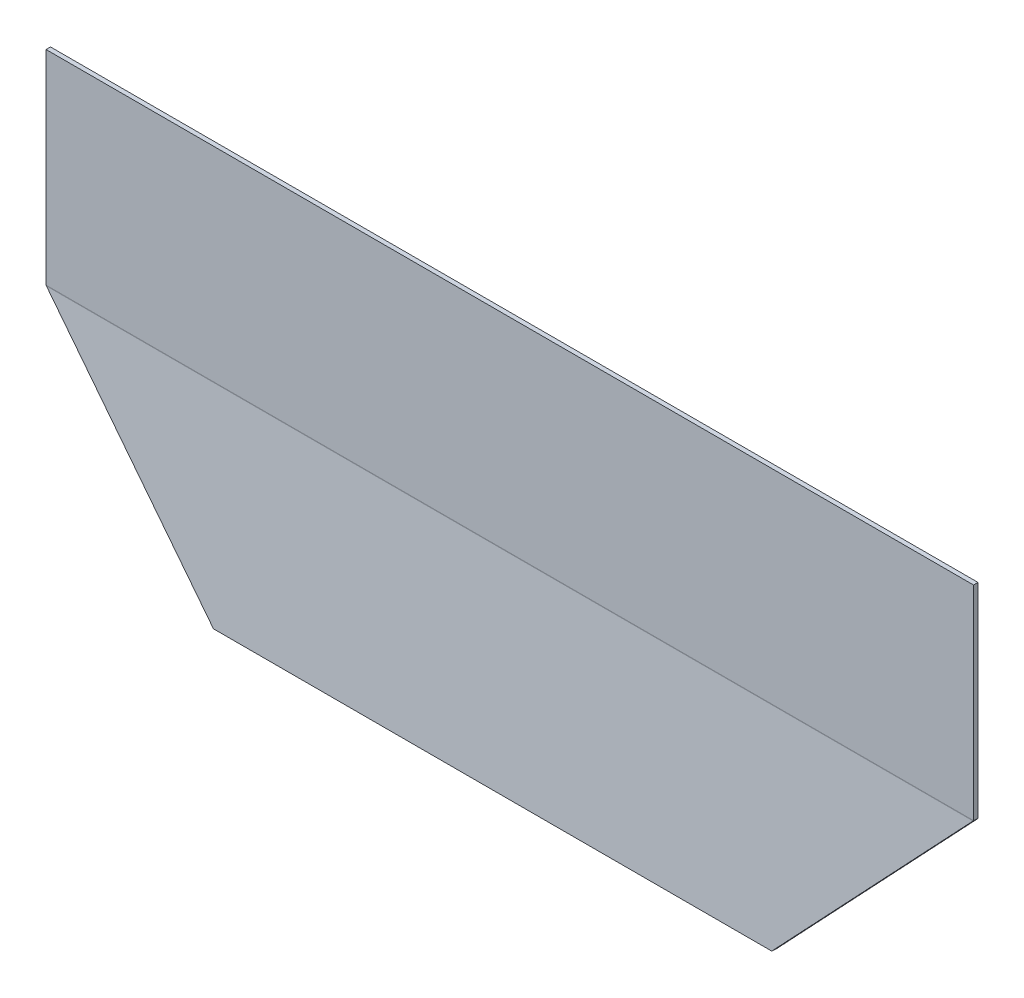
ISO-10303-21;
HEADER;
FILE_DESCRIPTION(('STEP AP214'),'2;1');
FILE_NAME('part.step','',(''),(''),'','','');
FILE_SCHEMA(('AUTOMOTIVE_DESIGN { 1 0 10303 214 1 1 1 1 }'));
ENDSEC;
DATA;
#1=APPLICATION_CONTEXT('core data for automotive mechanical design processes');
#2=APPLICATION_PROTOCOL_DEFINITION('international standard','automotive_design',2000,#1);
#3=PRODUCT_CONTEXT('',#1,'mechanical');
#4=PRODUCT('Part','Part','',(#3));
#5=PRODUCT_RELATED_PRODUCT_CATEGORY('part','',(#4));
#6=PRODUCT_DEFINITION_FORMATION('','',#4);
#7=PRODUCT_DEFINITION_CONTEXT('part definition',#1,'design');
#8=PRODUCT_DEFINITION('design','',#6,#7);
#9=PRODUCT_DEFINITION_SHAPE('','',#8);
#10=(LENGTH_UNIT() NAMED_UNIT(*) SI_UNIT(.MILLI.,.METRE.));
#11=(NAMED_UNIT(*) PLANE_ANGLE_UNIT() SI_UNIT($,.RADIAN.));
#12=(NAMED_UNIT(*) SI_UNIT($,.STERADIAN.) SOLID_ANGLE_UNIT());
#13=UNCERTAINTY_MEASURE_WITH_UNIT(LENGTH_MEASURE(1.E-05),#10,'distance_accuracy_value','');
#14=(GEOMETRIC_REPRESENTATION_CONTEXT(3) GLOBAL_UNCERTAINTY_ASSIGNED_CONTEXT((#13)) GLOBAL_UNIT_ASSIGNED_CONTEXT((#10,
#11,#12)) REPRESENTATION_CONTEXT('',''));
#15=CARTESIAN_POINT('',(0.,0.,0.));
#16=DIRECTION('',(0.,0.,1.));
#17=DIRECTION('',(1.,0.,0.));
#18=AXIS2_PLACEMENT_3D('',#15,#16,#17);
#19=CARTESIAN_POINT('',(2065.69422165062,908.207331370393,-39.9072629011438));
#20=DIRECTION('',(0.,-0.0871557427476584,-0.996194698091746));
#21=DIRECTION('',(-1.,0.,0.));
#22=AXIS2_PLACEMENT_3D('',#19,#20,#21);
#23=PLANE('',#22);
#24=DIRECTION('',(0.683018857342538,-0.727621344344279,0.0636586189696172));
#25=VECTOR('',#24,1.);
#26=CARTESIAN_POINT('',(-11.1757783493806,452.065229150273,0.));
#27=LINE('',#26,#25);
#28=CARTESIAN_POINT('',(-10.2775489175716,451.108343553812,0.0837166419815905));
#29=VERTEX_POINT('',#28);
#30=CARTESIAN_POINT('',(402.259221650619,11.6321030878222,38.5329055717487));
#31=VERTEX_POINT('',#30);
#32=EDGE_CURVE('E79',#29,#31,#27,.T.);
#33=ORIENTED_EDGE('',*,*,#32,.F.);
#34=DIRECTION('',(1.,0.,0.));
#35=VECTOR('',#34,1.);
#36=CARTESIAN_POINT('',(2065.69422165062,451.108343553812,0.0837166419815974));
#37=LINE('',#36,#35);
#38=CARTESIAN_POINT('',(2064.79599221881,451.108343553812,0.0837166419815974));
#39=VERTEX_POINT('',#38);
#40=EDGE_CURVE('E72',#29,#39,#37,.T.);
#41=ORIENTED_EDGE('',*,*,#40,.T.);
#42=DIRECTION('',(0.683018857342538,0.727621344344279,-0.0636586189696172));
#43=VECTOR('',#42,1.);
#44=CARTESIAN_POINT('',(2065.69422165062,452.065229150273,0.));
#45=LINE('',#44,#43);
#46=CARTESIAN_POINT('',(1652.25922165062,11.6321030878223,38.5329055717487));
#47=VERTEX_POINT('',#46);
#48=EDGE_CURVE('E87',#47,#39,#45,.T.);
#49=ORIENTED_EDGE('',*,*,#48,.F.);
#50=DIRECTION('',(1.,0.,0.));
#51=VECTOR('',#50,1.);
#52=CARTESIAN_POINT('',(402.259221650619,11.6321030878222,38.5329055717487));
#53=LINE('',#52,#51);
#54=EDGE_CURVE('E372',#31,#47,#53,.T.);
#55=ORIENTED_EDGE('',*,*,#54,.F.);
#56=EDGE_LOOP('',(#33,#41,#49,#55));
#57=FACE_BOUND('',#56,.T.);
#58=ADVANCED_FACE('F59',(#57),#23,.T.);
#59=CARTESIAN_POINT('',(-11.1757783493806,452.93678657775,9.96194698091745));
#60=DIRECTION('',(0.730400739672746,0.680419764381318,-0.0595290158223458));
#61=DIRECTION('',(-0.683018857342538,0.727621344344279,-0.0636586189696172));
#62=AXIS2_PLACEMENT_3D('',#59,#60,#61);
#63=PLANE('',#62);
#64=CARTESIAN_POINT('',(-10.2775489175717,451.108343553812,0.0837166419816009));
#65=CARTESIAN_POINT('',(-10.2775489175717,451.979900981288,10.0456636228991));
#66=B_SPLINE_CURVE_WITH_KNOTS('',1,(#64,#65),.UNSPECIFIED.,.F.,.F.,(2,2),(0.,1.),.UNSPECIFIED.);
#67=CARTESIAN_POINT('',(-10.2775489175716,451.979900981288,10.0456636228991));
#68=VERTEX_POINT('',#67);
#69=EDGE_CURVE('E12',#29,#68,#66,.T.);
#70=ORIENTED_EDGE('',*,*,#69,.F.);
#71=ORIENTED_EDGE('',*,*,#32,.T.);
#72=DIRECTION('',(0.,-0.0871557427476584,-0.996194698091746));
#73=VECTOR('',#72,1.);
#74=CARTESIAN_POINT('',(402.259221650619,12.5036605152988,48.4948525526661));
#75=LINE('',#74,#73);
#76=CARTESIAN_POINT('',(402.259221650619,12.5036605152988,48.4948525526661));
#77=VERTEX_POINT('',#76);
#78=EDGE_CURVE('E378',#77,#31,#75,.T.);
#79=ORIENTED_EDGE('',*,*,#78,.F.);
#80=DIRECTION('',(0.683018857342538,-0.727621344344279,0.0636586189696172));
#81=VECTOR('',#80,1.);
#82=CARTESIAN_POINT('',(-11.1757783493806,452.93678657775,9.96194698091745));
#83=LINE('',#82,#81);
#84=EDGE_CURVE('E371',#68,#77,#83,.T.);
#85=ORIENTED_EDGE('',*,*,#84,.F.);
#86=EDGE_LOOP('',(#70,#71,#79,#85));
#87=FACE_BOUND('',#86,.T.);
#88=ADVANCED_FACE('F61',(#87),#63,.F.);
#89=CARTESIAN_POINT('',(402.259221650619,12.5036605152988,48.4948525526661));
#90=DIRECTION('',(0.,0.996194698091746,-0.0871557427476584));
#91=DIRECTION('',(-1.,0.,0.));
#92=AXIS2_PLACEMENT_3D('',#89,#90,#91);
#93=PLANE('',#92);
#94=ORIENTED_EDGE('',*,*,#54,.T.);
#95=DIRECTION('',(0.,-0.0871557427476584,-0.996194698091746));
#96=VECTOR('',#95,1.);
#97=CARTESIAN_POINT('',(1652.25922165062,12.5036605152988,48.4948525526661));
#98=LINE('',#97,#96);
#99=CARTESIAN_POINT('',(1652.25922165062,12.5036605152988,48.4948525526661));
#100=VERTEX_POINT('',#99);
#101=EDGE_CURVE('E375',#100,#47,#98,.T.);
#102=ORIENTED_EDGE('',*,*,#101,.F.);
#103=DIRECTION('',(1.,0.,0.));
#104=VECTOR('',#103,1.);
#105=CARTESIAN_POINT('',(402.259221650619,12.5036605152988,48.4948525526661));
#106=LINE('',#105,#104);
#107=EDGE_CURVE('E367',#77,#100,#106,.T.);
#108=ORIENTED_EDGE('',*,*,#107,.F.);
#109=ORIENTED_EDGE('',*,*,#78,.T.);
#110=EDGE_LOOP('',(#94,#102,#108,#109));
#111=FACE_BOUND('',#110,.T.);
#112=ADVANCED_FACE('F466',(#111),#93,.F.);
#113=CARTESIAN_POINT('',(2065.69422165062,452.93678657775,9.96194698091745));
#114=DIRECTION('',(-0.730400739672746,0.680419764381318,-0.0595290158223458));
#115=DIRECTION('',(-0.683018857342538,-0.727621344344279,0.0636586189696172));
#116=AXIS2_PLACEMENT_3D('',#113,#114,#115);
#117=PLANE('',#116);
#118=CARTESIAN_POINT('',(2064.79599221881,451.979900981288,10.0456636228991));
#119=CARTESIAN_POINT('',(2064.79599221881,451.108343553812,0.0837166419816009));
#120=B_SPLINE_CURVE_WITH_KNOTS('',1,(#118,#119),.UNSPECIFIED.,.F.,.F.,(2,2),(0.,1.),.UNSPECIFIED.);
#121=CARTESIAN_POINT('',(2064.79599221881,451.979900981288,10.0456636228991));
#122=VERTEX_POINT('',#121);
#123=EDGE_CURVE('E280',#122,#39,#120,.T.);
#124=ORIENTED_EDGE('',*,*,#123,.F.);
#125=DIRECTION('',(0.683018857342538,0.727621344344279,-0.0636586189696172));
#126=VECTOR('',#125,1.);
#127=CARTESIAN_POINT('',(2065.69422165062,452.93678657775,9.96194698091745));
#128=LINE('',#127,#126);
#129=EDGE_CURVE('E370',#100,#122,#128,.T.);
#130=ORIENTED_EDGE('',*,*,#129,.F.);
#131=ORIENTED_EDGE('',*,*,#101,.T.);
#132=ORIENTED_EDGE('',*,*,#48,.T.);
#133=EDGE_LOOP('',(#124,#130,#131,#132));
#134=FACE_BOUND('',#133,.T.);
#135=ADVANCED_FACE('F469',(#134),#117,.F.);
#136=CARTESIAN_POINT('',(2065.69422165062,909.07888879787,-29.9453159202264));
#137=DIRECTION('',(0.,-0.0871557427476584,-0.996194698091746));
#138=DIRECTION('',(-1.,0.,0.));
#139=AXIS2_PLACEMENT_3D('',#136,#137,#138);
#140=PLANE('',#139);
#141=DIRECTION('',(1.,0.,0.));
#142=VECTOR('',#141,1.);
#143=CARTESIAN_POINT('',(2065.69422165062,451.979900981288,10.0456636228991));
#144=LINE('',#143,#142);
#145=EDGE_CURVE('E299',#68,#122,#144,.T.);
#146=ORIENTED_EDGE('',*,*,#145,.F.);
#147=ORIENTED_EDGE('',*,*,#84,.T.);
#148=ORIENTED_EDGE('',*,*,#107,.T.);
#149=ORIENTED_EDGE('',*,*,#129,.T.);
#150=EDGE_LOOP('',(#146,#147,#148,#149));
#151=FACE_BOUND('',#150,.T.);
#152=ADVANCED_FACE('F451',(#151),#140,.F.);
#153=CARTESIAN_POINT('',(-11.1757783493806,909.949720097555,10.));
#154=DIRECTION('',(0.,-1.,0.));
#155=DIRECTION('',(0.,0.,-1.));
#156=AXIS2_PLACEMENT_3D('',#153,#154,#155);
#157=PLANE('',#156);
#158=DIRECTION('',(-1.,0.,0.));
#159=VECTOR('',#158,1.);
#160=CARTESIAN_POINT('',(-11.1757783493806,909.949720097555,0.));
#161=LINE('',#160,#159);
#162=CARTESIAN_POINT('',(2065.69422165062,909.949720097555,0.));
#163=VERTEX_POINT('',#162);
#164=CARTESIAN_POINT('',(-11.1757783493806,909.949720097555,0.));
#165=VERTEX_POINT('',#164);
#166=EDGE_CURVE('E362',#163,#165,#161,.T.);
#167=ORIENTED_EDGE('',*,*,#166,.T.);
#168=DIRECTION('',(0.,0.,-1.));
#169=VECTOR('',#168,1.);
#170=CARTESIAN_POINT('',(-11.1757783493806,909.949720097555,10.));
#171=LINE('',#170,#169);
#172=CARTESIAN_POINT('',(-11.1757783493806,909.949720097555,10.));
#173=VERTEX_POINT('',#172);
#174=EDGE_CURVE('E411',#173,#165,#171,.T.);
#175=ORIENTED_EDGE('',*,*,#174,.F.);
#176=DIRECTION('',(-1.,0.,0.));
#177=VECTOR('',#176,1.);
#178=CARTESIAN_POINT('',(-11.1757783493806,909.949720097555,10.));
#179=LINE('',#178,#177);
#180=CARTESIAN_POINT('',(2065.69422165062,909.949720097555,10.));
#181=VERTEX_POINT('',#180);
#182=EDGE_CURVE('E341',#181,#173,#179,.T.);
#183=ORIENTED_EDGE('',*,*,#182,.F.);
#184=DIRECTION('',(0.,0.,-1.));
#185=VECTOR('',#184,1.);
#186=CARTESIAN_POINT('',(2065.69422165062,909.949720097555,10.));
#187=LINE('',#186,#185);
#188=EDGE_CURVE('E358',#181,#163,#187,.T.);
#189=ORIENTED_EDGE('',*,*,#188,.T.);
#190=EDGE_LOOP('',(#167,#175,#183,#189));
#191=FACE_BOUND('',#190,.T.);
#192=ADVANCED_FACE('F447',(#191),#157,.F.);
#193=CARTESIAN_POINT('',(2065.69422165062,909.949720097555,10.));
#194=DIRECTION('',(0.,0.,-1.));
#195=DIRECTION('',(-1.,0.,0.));
#196=AXIS2_PLACEMENT_3D('',#193,#194,#195);
#197=PLANE('',#196);
#198=DIRECTION('',(0.,-1.,0.));
#199=VECTOR('',#198,1.);
#200=CARTESIAN_POINT('',(-11.1757783493806,452.065229150273,10.));
#201=LINE('',#200,#199);
#202=CARTESIAN_POINT('',(-11.1757783493807,453.02576989426,10.));
#203=VERTEX_POINT('',#202);
#204=EDGE_CURVE('E355',#173,#203,#201,.T.);
#205=ORIENTED_EDGE('',*,*,#204,.T.);
#206=DIRECTION('',(1.,0.,0.));
#207=VECTOR('',#206,1.);
#208=CARTESIAN_POINT('',(2065.69422165062,453.02576989426,10.));
#209=LINE('',#208,#207);
#210=CARTESIAN_POINT('',(2065.69422165062,453.02576989426,10.));
#211=VERTEX_POINT('',#210);
#212=EDGE_CURVE('E175',#203,#211,#209,.T.);
#213=ORIENTED_EDGE('',*,*,#212,.T.);
#214=DIRECTION('',(0.,1.,0.));
#215=VECTOR('',#214,1.);
#216=CARTESIAN_POINT('',(2065.69422165062,452.065229150273,10.));
#217=LINE('',#216,#215);
#218=EDGE_CURVE('E347',#211,#181,#217,.T.);
#219=ORIENTED_EDGE('',*,*,#218,.T.);
#220=ORIENTED_EDGE('',*,*,#182,.T.);
#221=EDGE_LOOP('',(#205,#213,#219,#220));
#222=FACE_BOUND('',#221,.T.);
#223=ADVANCED_FACE('F450',(#222),#197,.F.);
#224=CARTESIAN_POINT('',(2065.69422165062,452.065229150273,10.));
#225=DIRECTION('',(-1.,0.,0.));
#226=DIRECTION('',(0.,0.,1.));
#227=AXIS2_PLACEMENT_3D('',#224,#225,#226);
#228=PLANE('',#227);
#229=ORIENTED_EDGE('',*,*,#218,.F.);
#230=DIRECTION('',(0.,0.,-1.));
#231=VECTOR('',#230,1.);
#232=CARTESIAN_POINT('',(2065.69422165062,453.02576989426,10.));
#233=LINE('',#232,#231);
#234=CARTESIAN_POINT('',(2065.69422165062,453.02576989426,0.));
#235=VERTEX_POINT('',#234);
#236=EDGE_CURVE('E336',#211,#235,#233,.T.);
#237=ORIENTED_EDGE('',*,*,#236,.T.);
#238=DIRECTION('',(0.,1.,0.));
#239=VECTOR('',#238,1.);
#240=CARTESIAN_POINT('',(2065.69422165062,452.065229150273,0.));
#241=LINE('',#240,#239);
#242=EDGE_CURVE('E340',#235,#163,#241,.T.);
#243=ORIENTED_EDGE('',*,*,#242,.T.);
#244=ORIENTED_EDGE('',*,*,#188,.F.);
#245=EDGE_LOOP('',(#229,#237,#243,#244));
#246=FACE_BOUND('',#245,.T.);
#247=ADVANCED_FACE('F455',(#246),#228,.F.);
#248=CARTESIAN_POINT('',(2065.69422165062,909.949720097555,0.));
#249=DIRECTION('',(0.,0.,-1.));
#250=DIRECTION('',(-1.,0.,0.));
#251=AXIS2_PLACEMENT_3D('',#248,#249,#250);
#252=PLANE('',#251);
#253=DIRECTION('',(1.,0.,0.));
#254=VECTOR('',#253,1.);
#255=CARTESIAN_POINT('',(2065.69422165062,453.02576989426,0.));
#256=LINE('',#255,#254);
#257=CARTESIAN_POINT('',(-11.1757783493807,453.02576989426,0.));
#258=VERTEX_POINT('',#257);
#259=EDGE_CURVE('E156',#258,#235,#256,.T.);
#260=ORIENTED_EDGE('',*,*,#259,.F.);
#261=DIRECTION('',(0.,-1.,0.));
#262=VECTOR('',#261,1.);
#263=CARTESIAN_POINT('',(-11.1757783493806,452.065229150273,0.));
#264=LINE('',#263,#262);
#265=EDGE_CURVE('E345',#165,#258,#264,.T.);
#266=ORIENTED_EDGE('',*,*,#265,.F.);
#267=ORIENTED_EDGE('',*,*,#166,.F.);
#268=ORIENTED_EDGE('',*,*,#242,.F.);
#269=EDGE_LOOP('',(#260,#266,#267,#268));
#270=FACE_BOUND('',#269,.T.);
#271=ADVANCED_FACE('F459',(#270),#252,.T.);
#272=CARTESIAN_POINT('',(-11.1757783493806,452.065229150273,10.));
#273=DIRECTION('',(1.,0.,0.));
#274=DIRECTION('',(0.,1.,0.));
#275=AXIS2_PLACEMENT_3D('',#272,#273,#274);
#276=PLANE('',#275);
#277=ORIENTED_EDGE('',*,*,#265,.T.);
#278=DIRECTION('',(0.,0.,1.));
#279=VECTOR('',#278,1.);
#280=CARTESIAN_POINT('',(-11.1757783493806,453.02576989426,10.));
#281=LINE('',#280,#279);
#282=EDGE_CURVE('E420',#258,#203,#281,.T.);
#283=ORIENTED_EDGE('',*,*,#282,.T.);
#284=ORIENTED_EDGE('',*,*,#204,.F.);
#285=ORIENTED_EDGE('',*,*,#174,.T.);
#286=EDGE_LOOP('',(#277,#283,#284,#285));
#287=FACE_BOUND('',#286,.T.);
#288=ADVANCED_FACE('F462',(#287),#276,.F.);
#289=CARTESIAN_POINT('',(-11.1757783493807,452.066143372223,0.0209391251991299));
#290=CARTESIAN_POINT('',(-10.8763685210282,451.746470870971,0.0348963280257155));
#291=CARTESIAN_POINT('',(-10.5769587459241,451.427102993039,0.0558288046572932));
#292=CARTESIAN_POINT('',(-10.2775489175717,451.108343553812,0.0837166419816009));
#293=CARTESIAN_POINT('',(-11.1757783493807,452.502337245876,10.0114213410177));
#294=CARTESIAN_POINT('',(-10.8763685303276,452.327970432427,10.0190343605048));
#295=CARTESIAN_POINT('',(-10.5769587366247,452.153769760921,10.0304520757401));
#296=CARTESIAN_POINT('',(-10.2775489175717,451.979900981288,10.0456636228991));
#297=B_SPLINE_SURFACE_WITH_KNOTS('',1,3,((#289,#290,#291,#292),(#293,#294,#295,#296)),
.UNSPECIFIED.,.F.,.F.,.F.,(2,2),(4,4),(0.,1.),(0.,1.),.UNSPECIFIED.);
#298=CARTESIAN_POINT('',(-11.1757783493807,452.502337245876,10.0114213410177));
#299=CARTESIAN_POINT('',(-11.1757783493807,452.066143372223,0.0209391251991299));
#300=B_SPLINE_CURVE_WITH_KNOTS('',1,(#298,#299),.UNSPECIFIED.,.F.,.F.,(2,2),(0.,1.),.UNSPECIFIED.);
#301=CARTESIAN_POINT('',(-11.1757783493807,452.066143372223,0.0209391251991299));
#302=VERTEX_POINT('',#301);
#303=CARTESIAN_POINT('',(-11.1757783493807,452.502337245876,10.0114213410177));
#304=VERTEX_POINT('',#303);
#305=EDGE_CURVE('E142',#302,#304,#300,.F.);
#306=CARTESIAN_POINT('',(-11.1757783493807,452.066143372223,0.0209391251991299));
#307=CARTESIAN_POINT('',(-10.8763685210282,451.746470870971,0.0348963280257155));
#308=CARTESIAN_POINT('',(-10.5769587459241,451.427102993039,0.0558288046572932));
#309=CARTESIAN_POINT('',(-10.2775489175717,451.108343553812,0.0837166419816009));
#310=B_SPLINE_CURVE_WITH_KNOTS('',3,(#306,#307,#308,#309),.UNSPECIFIED.,.F.,.F.,(4,4),(0.,1.),.UNSPECIFIED.);
#311=EDGE_CURVE('E189',#302,#29,#310,.T.);
#312=CARTESIAN_POINT('',(-10.2775489175717,451.979900981288,10.0456636228991));
#313=CARTESIAN_POINT('',(-10.5769587366247,452.153769760921,10.0304520757401));
#314=CARTESIAN_POINT('',(-10.8763685303276,452.327970432427,10.0190343605048));
#315=CARTESIAN_POINT('',(-11.1757783493807,452.502337245876,10.0114213410177));
#316=B_SPLINE_CURVE_WITH_KNOTS('',3,(#312,#313,#314,#315),.UNSPECIFIED.,.F.,.F.,(4,4),(0.,1.),.UNSPECIFIED.);
#317=EDGE_CURVE('E161',#304,#68,#316,.F.);
#318=ORIENTED_EDGE('',*,*,#305,.F.);
#319=ORIENTED_EDGE('',*,*,#311,.T.);
#320=ORIENTED_EDGE('',*,*,#69,.T.);
#321=ORIENTED_EDGE('',*,*,#317,.F.);
#322=EDGE_LOOP('',(#318,#319,#320,#321));
#323=FACE_BOUND('',#322,.T.);
#324=ADVANCED_FACE('F163',(#323),#297,.F.);
#325=CARTESIAN_POINT('',(2064.79599221881,451.108343553812,0.0837166419816009));
#326=CARTESIAN_POINT('',(2065.09540204716,451.427102993038,0.0558288046574283));
#327=CARTESIAN_POINT('',(2065.39481182227,451.746470870972,0.0348963280256666));
#328=CARTESIAN_POINT('',(2065.69422165062,452.066143372223,0.0209391251991299));
#329=CARTESIAN_POINT('',(2064.79599221881,451.979900981288,10.0456636228991));
#330=CARTESIAN_POINT('',(2065.09540203786,452.15376976092,10.0304520757402));
#331=CARTESIAN_POINT('',(2065.39481183157,452.327970432428,10.0190343605048));
#332=CARTESIAN_POINT('',(2065.69422165062,452.502337245876,10.0114213410177));
#333=B_SPLINE_SURFACE_WITH_KNOTS('',1,3,((#325,#326,#327,#328),(#329,#330,#331,#332)),
.UNSPECIFIED.,.F.,.F.,.F.,(2,2),(4,4),(0.,1.),(0.,1.),.UNSPECIFIED.);
#334=CARTESIAN_POINT('',(2064.79599221881,451.108343553812,0.0837166419816009));
#335=CARTESIAN_POINT('',(2065.09540204716,451.427102993038,0.0558288046574283));
#336=CARTESIAN_POINT('',(2065.39481182227,451.746470870972,0.0348963280256666));
#337=CARTESIAN_POINT('',(2065.69422165062,452.066143372223,0.0209391251991299));
#338=B_SPLINE_CURVE_WITH_KNOTS('',3,(#334,#335,#336,#337),.UNSPECIFIED.,.F.,.F.,(4,4),(0.,1.),.UNSPECIFIED.);
#339=CARTESIAN_POINT('',(2065.69422165062,452.066143372223,0.0209391251991299));
#340=VERTEX_POINT('',#339);
#341=EDGE_CURVE('E295',#39,#340,#338,.T.);
#342=CARTESIAN_POINT('',(2065.69422165062,452.066143372223,0.0209391251991299));
#343=CARTESIAN_POINT('',(2065.69422165062,452.502337245876,10.0114213410177));
#344=B_SPLINE_CURVE_WITH_KNOTS('',1,(#342,#343),.UNSPECIFIED.,.F.,.F.,(2,2),(0.,1.),.UNSPECIFIED.);
#345=CARTESIAN_POINT('',(2065.69422165062,452.502337245876,10.0114213410177));
#346=VERTEX_POINT('',#345);
#347=EDGE_CURVE('E157',#340,#346,#344,.T.);
#348=CARTESIAN_POINT('',(2065.69422165062,452.502337245876,10.0114213410177));
#349=CARTESIAN_POINT('',(2065.39481183157,452.327970432428,10.0190343605048));
#350=CARTESIAN_POINT('',(2065.09540203786,452.15376976092,10.0304520757402));
#351=CARTESIAN_POINT('',(2064.79599221881,451.979900981288,10.0456636228991));
#352=B_SPLINE_CURVE_WITH_KNOTS('',3,(#348,#349,#350,#351),.UNSPECIFIED.,.F.,.F.,(4,4),(0.,1.),.UNSPECIFIED.);
#353=EDGE_CURVE('E169',#122,#346,#352,.F.);
#354=ORIENTED_EDGE('',*,*,#123,.T.);
#355=ORIENTED_EDGE('',*,*,#341,.T.);
#356=ORIENTED_EDGE('',*,*,#347,.T.);
#357=ORIENTED_EDGE('',*,*,#353,.F.);
#358=EDGE_LOOP('',(#354,#355,#356,#357));
#359=FACE_BOUND('',#358,.T.);
#360=ADVANCED_FACE('F231',(#359),#333,.F.);
#361=CARTESIAN_POINT('',(2065.69422165062,453.02576989426,22.));
#362=DIRECTION('',(-1.,0.,0.));
#363=DIRECTION('',(0.,0.,1.));
#364=AXIS2_PLACEMENT_3D('',#361,#362,#363);
#365=PLANE('',#364);
#366=ORIENTED_EDGE('',*,*,#347,.F.);
#367=CARTESIAN_POINT('',(2065.69422165062,453.02576989426,22.));
#368=DIRECTION('',(1.,0.,0.));
#369=DIRECTION('',(0.,0.,-1.));
#370=AXIS2_PLACEMENT_3D('',#367,#368,#369);
#371=CIRCLE('',#370,22.);
#372=EDGE_CURVE('E301',#340,#235,#371,.T.);
#373=ORIENTED_EDGE('',*,*,#372,.T.);
#374=ORIENTED_EDGE('',*,*,#236,.F.);
#375=CARTESIAN_POINT('',(2065.69422165062,453.02576989426,22.));
#376=DIRECTION('',(1.,0.,0.));
#377=DIRECTION('',(0.,0.,-1.));
#378=AXIS2_PLACEMENT_3D('',#375,#376,#377);
#379=CIRCLE('',#378,12.);
#380=EDGE_CURVE('E177',#346,#211,#379,.T.);
#381=ORIENTED_EDGE('',*,*,#380,.F.);
#382=EDGE_LOOP('',(#366,#373,#374,#381));
#383=FACE_BOUND('',#382,.T.);
#384=ADVANCED_FACE('F205',(#383),#365,.F.);
#385=CARTESIAN_POINT('',(-11.1757783493807,453.02576989426,22.));
#386=DIRECTION('',(1.,0.,0.));
#387=DIRECTION('',(0.,0.,-1.));
#388=AXIS2_PLACEMENT_3D('',#385,#386,#387);
#389=PLANE('',#388);
#390=CARTESIAN_POINT('',(-11.1757783493807,453.02576989426,22.));
#391=DIRECTION('',(1.,0.,0.));
#392=DIRECTION('',(0.,0.,-1.));
#393=AXIS2_PLACEMENT_3D('',#390,#391,#392);
#394=CIRCLE('',#393,22.);
#395=EDGE_CURVE('E150',#258,#302,#394,.F.);
#396=ORIENTED_EDGE('',*,*,#395,.T.);
#397=ORIENTED_EDGE('',*,*,#305,.T.);
#398=CARTESIAN_POINT('',(-11.1757783493807,453.02576989426,22.));
#399=DIRECTION('',(-1.,0.,0.));
#400=DIRECTION('',(0.,0.,1.));
#401=AXIS2_PLACEMENT_3D('',#398,#399,#400);
#402=CIRCLE('',#401,12.);
#403=EDGE_CURVE('E147',#203,#304,#402,.T.);
#404=ORIENTED_EDGE('',*,*,#403,.F.);
#405=ORIENTED_EDGE('',*,*,#282,.F.);
#406=EDGE_LOOP('',(#396,#397,#404,#405));
#407=FACE_BOUND('',#406,.T.);
#408=ADVANCED_FACE('F145',(#407),#389,.F.);
#409=CARTESIAN_POINT('',(-1049.6357413781,453.02576989426,22.));
#410=DIRECTION('',(1.,0.,0.));
#411=DIRECTION('',(0.,0.,-1.));
#412=AXIS2_PLACEMENT_3D('',#409,#410,#411);
#413=CYLINDRICAL_SURFACE('',#412,12.);
#414=ORIENTED_EDGE('',*,*,#212,.F.);
#415=ORIENTED_EDGE('',*,*,#403,.T.);
#416=ORIENTED_EDGE('',*,*,#317,.T.);
#417=ORIENTED_EDGE('',*,*,#145,.T.);
#418=ORIENTED_EDGE('',*,*,#353,.T.);
#419=ORIENTED_EDGE('',*,*,#380,.T.);
#420=EDGE_LOOP('',(#414,#415,#416,#417,#418,#419));
#421=FACE_BOUND('',#420,.T.);
#422=ADVANCED_FACE('F172',(#421),#413,.F.);
#423=CARTESIAN_POINT('',(-1049.6357413781,453.02576989426,22.));
#424=DIRECTION('',(1.,0.,0.));
#425=DIRECTION('',(0.,0.,-1.));
#426=AXIS2_PLACEMENT_3D('',#423,#424,#425);
#427=CYLINDRICAL_SURFACE('',#426,22.);
#428=ORIENTED_EDGE('',*,*,#259,.T.);
#429=ORIENTED_EDGE('',*,*,#372,.F.);
#430=ORIENTED_EDGE('',*,*,#341,.F.);
#431=ORIENTED_EDGE('',*,*,#40,.F.);
#432=ORIENTED_EDGE('',*,*,#311,.F.);
#433=ORIENTED_EDGE('',*,*,#395,.F.);
#434=EDGE_LOOP('',(#428,#429,#430,#431,#432,#433));
#435=FACE_BOUND('',#434,.T.);
#436=ADVANCED_FACE('F194',(#435),#427,.T.);
#437=CLOSED_SHELL('',(#58,#88,#112,#135,#152,#192,#223,#247,#271,#288,#324,#360,#384,#408,#422,#436));
#438=MANIFOLD_SOLID_BREP('B2',#437);
#439=ADVANCED_BREP_SHAPE_REPRESENTATION('',(#18,#438),#14);
#440=SHAPE_DEFINITION_REPRESENTATION(#9,#439);
ENDSEC;
END-ISO-10303-21;
